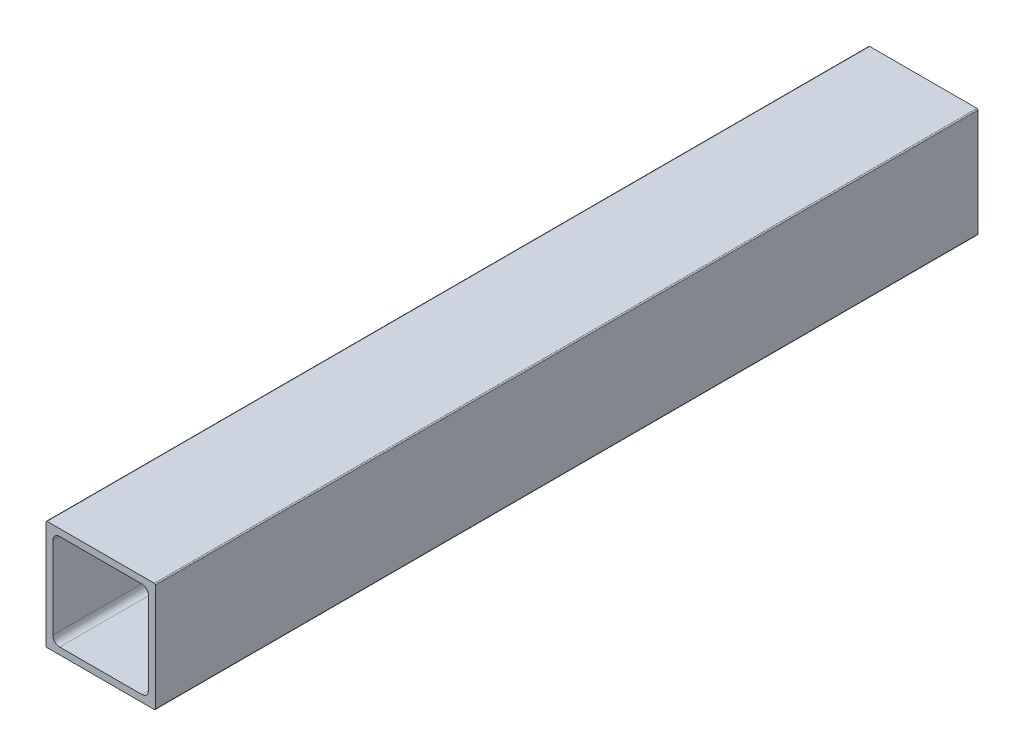
ISO-10303-21;
HEADER;
FILE_DESCRIPTION(('STEP AP214'),'2;1');
FILE_NAME('part.step','',(''),(''),'','','');
FILE_SCHEMA(('AUTOMOTIVE_DESIGN { 1 0 10303 214 1 1 1 1 }'));
ENDSEC;
DATA;
#1=APPLICATION_CONTEXT('core data for automotive mechanical design processes');
#2=APPLICATION_PROTOCOL_DEFINITION('international standard','automotive_design',2000,#1);
#3=PRODUCT_CONTEXT('',#1,'mechanical');
#4=PRODUCT('Part','Part','',(#3));
#5=PRODUCT_RELATED_PRODUCT_CATEGORY('part','',(#4));
#6=PRODUCT_DEFINITION_FORMATION('','',#4);
#7=PRODUCT_DEFINITION_CONTEXT('part definition',#1,'design');
#8=PRODUCT_DEFINITION('design','',#6,#7);
#9=PRODUCT_DEFINITION_SHAPE('','',#8);
#10=(LENGTH_UNIT() NAMED_UNIT(*) SI_UNIT(.MILLI.,.METRE.));
#11=(NAMED_UNIT(*) PLANE_ANGLE_UNIT() SI_UNIT($,.RADIAN.));
#12=(NAMED_UNIT(*) SI_UNIT($,.STERADIAN.) SOLID_ANGLE_UNIT());
#13=UNCERTAINTY_MEASURE_WITH_UNIT(LENGTH_MEASURE(1.E-05),#10,'distance_accuracy_value','');
#14=(GEOMETRIC_REPRESENTATION_CONTEXT(3) GLOBAL_UNCERTAINTY_ASSIGNED_CONTEXT((#13)) GLOBAL_UNIT_ASSIGNED_CONTEXT((#10,
#11,#12)) REPRESENTATION_CONTEXT('',''));
#15=CARTESIAN_POINT('',(0.,0.,0.));
#16=DIRECTION('',(0.,0.,1.));
#17=DIRECTION('',(1.,0.,0.));
#18=AXIS2_PLACEMENT_3D('',#15,#16,#17);
#19=CARTESIAN_POINT('',(1.5875,3.175,1828.8));
#20=DIRECTION('',(1.,0.,0.));
#21=DIRECTION('',(0.,1.,0.));
#22=AXIS2_PLACEMENT_3D('',#19,#20,#21);
#23=PLANE('',#22);
#24=DIRECTION('',(0.,0.,-1.));
#25=VECTOR('',#24,1.);
#26=CARTESIAN_POINT('',(1.5875,22.225,1828.8));
#27=LINE('',#26,#25);
#28=CARTESIAN_POINT('',(1.5875,22.225,191.008));
#29=VERTEX_POINT('',#28);
#30=CARTESIAN_POINT('',(1.5875,22.225,0.));
#31=VERTEX_POINT('',#30);
#32=EDGE_CURVE('E48',#29,#31,#27,.T.);
#33=ORIENTED_EDGE('',*,*,#32,.F.);
#34=DIRECTION('',(0.,-1.,0.));
#35=VECTOR('',#34,1.);
#36=CARTESIAN_POINT('',(1.5875,3.175,191.008));
#37=LINE('',#36,#35);
#38=CARTESIAN_POINT('',(1.5875,3.175,191.008));
#39=VERTEX_POINT('',#38);
#40=EDGE_CURVE('E262',#29,#39,#37,.T.);
#41=ORIENTED_EDGE('',*,*,#40,.T.);
#42=DIRECTION('',(0.,0.,-1.));
#43=VECTOR('',#42,1.);
#44=CARTESIAN_POINT('',(1.5875,3.175,1828.8));
#45=LINE('',#44,#43);
#46=CARTESIAN_POINT('',(1.5875,3.175,0.));
#47=VERTEX_POINT('',#46);
#48=EDGE_CURVE('E264',#39,#47,#45,.T.);
#49=ORIENTED_EDGE('',*,*,#48,.T.);
#50=DIRECTION('',(0.,-1.,0.));
#51=VECTOR('',#50,1.);
#52=CARTESIAN_POINT('',(1.5875,3.175,0.));
#53=LINE('',#52,#51);
#54=EDGE_CURVE('E216',#31,#47,#53,.T.);
#55=ORIENTED_EDGE('',*,*,#54,.F.);
#56=EDGE_LOOP('',(#33,#41,#49,#55));
#57=FACE_BOUND('',#56,.T.);
#58=ADVANCED_FACE('F40',(#57),#23,.T.);
#59=CARTESIAN_POINT('',(3.175,22.225,1828.8));
#60=DIRECTION('',(0.,0.,-1.));
#61=DIRECTION('',(-1.,0.,0.));
#62=AXIS2_PLACEMENT_3D('',#59,#60,#61);
#63=CYLINDRICAL_SURFACE('',#62,1.5875);
#64=CARTESIAN_POINT('',(3.175,22.225,191.008));
#65=DIRECTION('',(0.,0.,1.));
#66=DIRECTION('',(1.,0.,0.));
#67=AXIS2_PLACEMENT_3D('',#64,#65,#66);
#68=CIRCLE('',#67,1.5875);
#69=CARTESIAN_POINT('',(3.175,23.8125,191.008));
#70=VERTEX_POINT('',#69);
#71=EDGE_CURVE('E259',#29,#70,#68,.F.);
#72=ORIENTED_EDGE('',*,*,#71,.F.);
#73=ORIENTED_EDGE('',*,*,#32,.T.);
#74=CARTESIAN_POINT('',(3.175,22.225,0.));
#75=DIRECTION('',(0.,0.,1.));
#76=DIRECTION('',(-1.,0.,0.));
#77=AXIS2_PLACEMENT_3D('',#74,#75,#76);
#78=CIRCLE('',#77,1.5875);
#79=CARTESIAN_POINT('',(3.175,23.8125,0.));
#80=VERTEX_POINT('',#79);
#81=EDGE_CURVE('E186',#80,#31,#78,.T.);
#82=ORIENTED_EDGE('',*,*,#81,.F.);
#83=DIRECTION('',(0.,0.,-1.));
#84=VECTOR('',#83,1.);
#85=CARTESIAN_POINT('',(3.175,23.8125,1828.8));
#86=LINE('',#85,#84);
#87=EDGE_CURVE('E222',#70,#80,#86,.T.);
#88=ORIENTED_EDGE('',*,*,#87,.F.);
#89=EDGE_LOOP('',(#72,#73,#82,#88));
#90=FACE_BOUND('',#89,.T.);
#91=ADVANCED_FACE('F257',(#90),#63,.F.);
#92=CARTESIAN_POINT('',(3.175,23.8125,1828.8));
#93=DIRECTION('',(0.,-1.,0.));
#94=DIRECTION('',(0.,0.,-1.));
#95=AXIS2_PLACEMENT_3D('',#92,#93,#94);
#96=PLANE('',#95);
#97=DIRECTION('',(0.,0.,-1.));
#98=VECTOR('',#97,1.);
#99=CARTESIAN_POINT('',(22.225,23.8125,1828.8));
#100=LINE('',#99,#98);
#101=CARTESIAN_POINT('',(22.225,23.8125,191.008));
#102=VERTEX_POINT('',#101);
#103=CARTESIAN_POINT('',(22.225,23.8125,0.));
#104=VERTEX_POINT('',#103);
#105=EDGE_CURVE('E224',#102,#104,#100,.T.);
#106=ORIENTED_EDGE('',*,*,#105,.F.);
#107=DIRECTION('',(-1.,0.,0.));
#108=VECTOR('',#107,1.);
#109=CARTESIAN_POINT('',(3.175,23.8125,191.008));
#110=LINE('',#109,#108);
#111=EDGE_CURVE('E254',#102,#70,#110,.T.);
#112=ORIENTED_EDGE('',*,*,#111,.T.);
#113=ORIENTED_EDGE('',*,*,#87,.T.);
#114=DIRECTION('',(-1.,0.,0.));
#115=VECTOR('',#114,1.);
#116=CARTESIAN_POINT('',(3.175,23.8125,0.));
#117=LINE('',#116,#115);
#118=EDGE_CURVE('E191',#104,#80,#117,.T.);
#119=ORIENTED_EDGE('',*,*,#118,.F.);
#120=EDGE_LOOP('',(#106,#112,#113,#119));
#121=FACE_BOUND('',#120,.T.);
#122=ADVANCED_FACE('F251',(#121),#96,.T.);
#123=CARTESIAN_POINT('',(22.225,22.225,1828.8));
#124=DIRECTION('',(0.,0.,-1.));
#125=DIRECTION('',(-1.,0.,0.));
#126=AXIS2_PLACEMENT_3D('',#123,#124,#125);
#127=CYLINDRICAL_SURFACE('',#126,1.5875);
#128=CARTESIAN_POINT('',(22.225,22.225,191.008));
#129=DIRECTION('',(0.,0.,1.));
#130=DIRECTION('',(1.,0.,0.));
#131=AXIS2_PLACEMENT_3D('',#128,#129,#130);
#132=CIRCLE('',#131,1.5875);
#133=CARTESIAN_POINT('',(23.8125,22.225,191.008));
#134=VERTEX_POINT('',#133);
#135=EDGE_CURVE('E312',#102,#134,#132,.F.);
#136=ORIENTED_EDGE('',*,*,#135,.F.);
#137=ORIENTED_EDGE('',*,*,#105,.T.);
#138=CARTESIAN_POINT('',(22.225,22.225,0.));
#139=DIRECTION('',(0.,0.,1.));
#140=DIRECTION('',(-1.,0.,0.));
#141=AXIS2_PLACEMENT_3D('',#138,#139,#140);
#142=CIRCLE('',#141,1.5875);
#143=CARTESIAN_POINT('',(23.8125,22.225,0.));
#144=VERTEX_POINT('',#143);
#145=EDGE_CURVE('E232',#144,#104,#142,.T.);
#146=ORIENTED_EDGE('',*,*,#145,.F.);
#147=DIRECTION('',(0.,0.,-1.));
#148=VECTOR('',#147,1.);
#149=CARTESIAN_POINT('',(23.8125,22.225,1828.8));
#150=LINE('',#149,#148);
#151=EDGE_CURVE('E220',#134,#144,#150,.T.);
#152=ORIENTED_EDGE('',*,*,#151,.F.);
#153=EDGE_LOOP('',(#136,#137,#146,#152));
#154=FACE_BOUND('',#153,.T.);
#155=ADVANCED_FACE('F369',(#154),#127,.F.);
#156=CARTESIAN_POINT('',(23.8125,3.175,1828.8));
#157=DIRECTION('',(-1.,0.,0.));
#158=DIRECTION('',(0.,0.,1.));
#159=AXIS2_PLACEMENT_3D('',#156,#157,#158);
#160=PLANE('',#159);
#161=DIRECTION('',(0.,0.,-1.));
#162=VECTOR('',#161,1.);
#163=CARTESIAN_POINT('',(23.8125,3.175,1828.8));
#164=LINE('',#163,#162);
#165=CARTESIAN_POINT('',(23.8125,3.175,191.008));
#166=VERTEX_POINT('',#165);
#167=CARTESIAN_POINT('',(23.8125,3.175,0.));
#168=VERTEX_POINT('',#167);
#169=EDGE_CURVE('E218',#166,#168,#164,.T.);
#170=ORIENTED_EDGE('',*,*,#169,.F.);
#171=DIRECTION('',(0.,1.,0.));
#172=VECTOR('',#171,1.);
#173=CARTESIAN_POINT('',(23.8125,3.175,191.008));
#174=LINE('',#173,#172);
#175=EDGE_CURVE('E314',#166,#134,#174,.T.);
#176=ORIENTED_EDGE('',*,*,#175,.T.);
#177=ORIENTED_EDGE('',*,*,#151,.T.);
#178=DIRECTION('',(0.,1.,0.));
#179=VECTOR('',#178,1.);
#180=CARTESIAN_POINT('',(23.8125,3.175,0.));
#181=LINE('',#180,#179);
#182=EDGE_CURVE('E195',#168,#144,#181,.T.);
#183=ORIENTED_EDGE('',*,*,#182,.F.);
#184=EDGE_LOOP('',(#170,#176,#177,#183));
#185=FACE_BOUND('',#184,.T.);
#186=ADVANCED_FACE('F373',(#185),#160,.T.);
#187=CARTESIAN_POINT('',(22.225,3.175,1828.8));
#188=DIRECTION('',(0.,0.,-1.));
#189=DIRECTION('',(-1.,0.,0.));
#190=AXIS2_PLACEMENT_3D('',#187,#188,#189);
#191=CYLINDRICAL_SURFACE('',#190,1.5875);
#192=CARTESIAN_POINT('',(22.225,3.175,191.008));
#193=DIRECTION('',(0.,0.,1.));
#194=DIRECTION('',(1.,0.,0.));
#195=AXIS2_PLACEMENT_3D('',#192,#193,#194);
#196=CIRCLE('',#195,1.5875);
#197=CARTESIAN_POINT('',(22.225,1.5875,191.008));
#198=VERTEX_POINT('',#197);
#199=EDGE_CURVE('E317',#166,#198,#196,.F.);
#200=ORIENTED_EDGE('',*,*,#199,.F.);
#201=ORIENTED_EDGE('',*,*,#169,.T.);
#202=CARTESIAN_POINT('',(22.225,3.175,0.));
#203=DIRECTION('',(0.,0.,1.));
#204=DIRECTION('',(-1.,0.,0.));
#205=AXIS2_PLACEMENT_3D('',#202,#203,#204);
#206=CIRCLE('',#205,1.5875);
#207=CARTESIAN_POINT('',(22.225,1.5875,0.));
#208=VERTEX_POINT('',#207);
#209=EDGE_CURVE('E294',#208,#168,#206,.T.);
#210=ORIENTED_EDGE('',*,*,#209,.F.);
#211=DIRECTION('',(0.,0.,-1.));
#212=VECTOR('',#211,1.);
#213=CARTESIAN_POINT('',(22.225,1.5875,1828.8));
#214=LINE('',#213,#212);
#215=EDGE_CURVE('E221',#198,#208,#214,.T.);
#216=ORIENTED_EDGE('',*,*,#215,.F.);
#217=EDGE_LOOP('',(#200,#201,#210,#216));
#218=FACE_BOUND('',#217,.T.);
#219=ADVANCED_FACE('F370',(#218),#191,.F.);
#220=CARTESIAN_POINT('',(3.175,1.5875,1828.8));
#221=DIRECTION('',(0.,1.,0.));
#222=DIRECTION('',(1.,0.,0.));
#223=AXIS2_PLACEMENT_3D('',#220,#221,#222);
#224=PLANE('',#223);
#225=DIRECTION('',(0.,0.,-1.));
#226=VECTOR('',#225,1.);
#227=CARTESIAN_POINT('',(3.175,1.5875,1828.8));
#228=LINE('',#227,#226);
#229=CARTESIAN_POINT('',(3.175,1.5875,191.008));
#230=VERTEX_POINT('',#229);
#231=CARTESIAN_POINT('',(3.175,1.5875,0.));
#232=VERTEX_POINT('',#231);
#233=EDGE_CURVE('E277',#230,#232,#228,.T.);
#234=ORIENTED_EDGE('',*,*,#233,.F.);
#235=DIRECTION('',(1.,0.,0.));
#236=VECTOR('',#235,1.);
#237=CARTESIAN_POINT('',(3.175,1.5875,191.008));
#238=LINE('',#237,#236);
#239=EDGE_CURVE('E55',#230,#198,#238,.T.);
#240=ORIENTED_EDGE('',*,*,#239,.T.);
#241=ORIENTED_EDGE('',*,*,#215,.T.);
#242=DIRECTION('',(1.,0.,0.));
#243=VECTOR('',#242,1.);
#244=CARTESIAN_POINT('',(3.175,1.5875,0.));
#245=LINE('',#244,#243);
#246=EDGE_CURVE('E215',#232,#208,#245,.T.);
#247=ORIENTED_EDGE('',*,*,#246,.F.);
#248=EDGE_LOOP('',(#234,#240,#241,#247));
#249=FACE_BOUND('',#248,.T.);
#250=ADVANCED_FACE('F372',(#249),#224,.T.);
#251=CARTESIAN_POINT('',(3.175,3.175,1828.8));
#252=DIRECTION('',(0.,0.,-1.));
#253=DIRECTION('',(-1.,0.,0.));
#254=AXIS2_PLACEMENT_3D('',#251,#252,#253);
#255=CYLINDRICAL_SURFACE('',#254,1.5875);
#256=CARTESIAN_POINT('',(3.175,3.175,191.008));
#257=DIRECTION('',(0.,0.,1.));
#258=DIRECTION('',(1.,0.,0.));
#259=AXIS2_PLACEMENT_3D('',#256,#257,#258);
#260=CIRCLE('',#259,1.5875);
#261=EDGE_CURVE('E320',#230,#39,#260,.F.);
#262=ORIENTED_EDGE('',*,*,#261,.F.);
#263=ORIENTED_EDGE('',*,*,#233,.T.);
#264=CARTESIAN_POINT('',(3.175,3.175,0.));
#265=DIRECTION('',(0.,0.,1.));
#266=DIRECTION('',(1.,0.,0.));
#267=AXIS2_PLACEMENT_3D('',#264,#265,#266);
#268=CIRCLE('',#267,1.5875);
#269=EDGE_CURVE('E211',#47,#232,#268,.T.);
#270=ORIENTED_EDGE('',*,*,#269,.F.);
#271=ORIENTED_EDGE('',*,*,#48,.F.);
#272=EDGE_LOOP('',(#262,#263,#270,#271));
#273=FACE_BOUND('',#272,.T.);
#274=ADVANCED_FACE('F391',(#273),#255,.F.);
#275=CARTESIAN_POINT('',(0.,0.254,1828.8));
#276=DIRECTION('',(1.,0.,0.));
#277=DIRECTION('',(0.,1.,0.));
#278=AXIS2_PLACEMENT_3D('',#275,#276,#277);
#279=PLANE('',#278);
#280=DIRECTION('',(0.,-1.,0.));
#281=VECTOR('',#280,1.);
#282=CARTESIAN_POINT('',(0.,0.254,191.008));
#283=LINE('',#282,#281);
#284=CARTESIAN_POINT('',(0.,25.146,191.008));
#285=VERTEX_POINT('',#284);
#286=CARTESIAN_POINT('',(0.,0.254,191.008));
#287=VERTEX_POINT('',#286);
#288=EDGE_CURVE('E63',#285,#287,#283,.T.);
#289=ORIENTED_EDGE('',*,*,#288,.F.);
#290=DIRECTION('',(0.,0.,-1.));
#291=VECTOR('',#290,1.);
#292=CARTESIAN_POINT('',(0.,25.146,1828.8));
#293=LINE('',#292,#291);
#294=CARTESIAN_POINT('',(0.,25.146,0.));
#295=VERTEX_POINT('',#294);
#296=EDGE_CURVE('E209',#285,#295,#293,.T.);
#297=ORIENTED_EDGE('',*,*,#296,.T.);
#298=DIRECTION('',(0.,-1.,0.));
#299=VECTOR('',#298,1.);
#300=CARTESIAN_POINT('',(0.,0.254,0.));
#301=LINE('',#300,#299);
#302=CARTESIAN_POINT('',(0.,0.254,0.));
#303=VERTEX_POINT('',#302);
#304=EDGE_CURVE('E275',#295,#303,#301,.T.);
#305=ORIENTED_EDGE('',*,*,#304,.T.);
#306=DIRECTION('',(0.,0.,-1.));
#307=VECTOR('',#306,1.);
#308=CARTESIAN_POINT('',(0.,0.254,1828.8));
#309=LINE('',#308,#307);
#310=EDGE_CURVE('E185',#287,#303,#309,.T.);
#311=ORIENTED_EDGE('',*,*,#310,.F.);
#312=EDGE_LOOP('',(#289,#297,#305,#311));
#313=FACE_BOUND('',#312,.T.);
#314=ADVANCED_FACE('F348',(#313),#279,.F.);
#315=CARTESIAN_POINT('',(0.254,25.146,1828.8));
#316=DIRECTION('',(0.,0.,-1.));
#317=DIRECTION('',(-1.,0.,0.));
#318=AXIS2_PLACEMENT_3D('',#315,#316,#317);
#319=CYLINDRICAL_SURFACE('',#318,0.254);
#320=ORIENTED_EDGE('',*,*,#296,.F.);
#321=CARTESIAN_POINT('',(0.254,25.146,191.008));
#322=DIRECTION('',(0.,0.,1.));
#323=DIRECTION('',(1.,0.,0.));
#324=AXIS2_PLACEMENT_3D('',#321,#322,#323);
#325=CIRCLE('',#324,0.254);
#326=CARTESIAN_POINT('',(0.254,25.4,191.008));
#327=VERTEX_POINT('',#326);
#328=EDGE_CURVE('E323',#285,#327,#325,.F.);
#329=ORIENTED_EDGE('',*,*,#328,.T.);
#330=DIRECTION('',(0.,0.,-1.));
#331=VECTOR('',#330,1.);
#332=CARTESIAN_POINT('',(0.254,25.4,1828.8));
#333=LINE('',#332,#331);
#334=CARTESIAN_POINT('',(0.254,25.4,0.));
#335=VERTEX_POINT('',#334);
#336=EDGE_CURVE('E207',#327,#335,#333,.T.);
#337=ORIENTED_EDGE('',*,*,#336,.T.);
#338=CARTESIAN_POINT('',(0.254,25.146,0.));
#339=DIRECTION('',(0.,0.,1.));
#340=DIRECTION('',(-1.,0.,0.));
#341=AXIS2_PLACEMENT_3D('',#338,#339,#340);
#342=CIRCLE('',#341,0.254);
#343=EDGE_CURVE('E206',#335,#295,#342,.T.);
#344=ORIENTED_EDGE('',*,*,#343,.T.);
#345=EDGE_LOOP('',(#320,#329,#337,#344));
#346=FACE_BOUND('',#345,.T.);
#347=ADVANCED_FACE('F345',(#346),#319,.T.);
#348=CARTESIAN_POINT('',(0.254,25.4,1828.8));
#349=DIRECTION('',(0.,-1.,0.));
#350=DIRECTION('',(0.,0.,-1.));
#351=AXIS2_PLACEMENT_3D('',#348,#349,#350);
#352=PLANE('',#351);
#353=DIRECTION('',(-1.,0.,0.));
#354=VECTOR('',#353,1.);
#355=CARTESIAN_POINT('',(0.254,25.4,191.008));
#356=LINE('',#355,#354);
#357=CARTESIAN_POINT('',(25.146,25.4,191.008));
#358=VERTEX_POINT('',#357);
#359=EDGE_CURVE('E326',#358,#327,#356,.T.);
#360=ORIENTED_EDGE('',*,*,#359,.F.);
#361=DIRECTION('',(0.,0.,-1.));
#362=VECTOR('',#361,1.);
#363=CARTESIAN_POINT('',(25.146,25.4,1828.8));
#364=LINE('',#363,#362);
#365=CARTESIAN_POINT('',(25.146,25.4,0.));
#366=VERTEX_POINT('',#365);
#367=EDGE_CURVE('E210',#358,#366,#364,.T.);
#368=ORIENTED_EDGE('',*,*,#367,.T.);
#369=DIRECTION('',(-1.,0.,0.));
#370=VECTOR('',#369,1.);
#371=CARTESIAN_POINT('',(0.254,25.4,0.));
#372=LINE('',#371,#370);
#373=EDGE_CURVE('E201',#366,#335,#372,.T.);
#374=ORIENTED_EDGE('',*,*,#373,.T.);
#375=ORIENTED_EDGE('',*,*,#336,.F.);
#376=EDGE_LOOP('',(#360,#368,#374,#375));
#377=FACE_BOUND('',#376,.T.);
#378=ADVANCED_FACE('F42',(#377),#352,.F.);
#379=CARTESIAN_POINT('',(25.146,25.146,1828.8));
#380=DIRECTION('',(0.,0.,-1.));
#381=DIRECTION('',(-1.,0.,0.));
#382=AXIS2_PLACEMENT_3D('',#379,#380,#381);
#383=CYLINDRICAL_SURFACE('',#382,0.254);
#384=ORIENTED_EDGE('',*,*,#367,.F.);
#385=CARTESIAN_POINT('',(25.146,25.146,191.008));
#386=DIRECTION('',(0.,0.,1.));
#387=DIRECTION('',(1.,0.,0.));
#388=AXIS2_PLACEMENT_3D('',#385,#386,#387);
#389=CIRCLE('',#388,0.254);
#390=CARTESIAN_POINT('',(25.4,25.146,191.008));
#391=VERTEX_POINT('',#390);
#392=EDGE_CURVE('E328',#358,#391,#389,.F.);
#393=ORIENTED_EDGE('',*,*,#392,.T.);
#394=DIRECTION('',(0.,0.,-1.));
#395=VECTOR('',#394,1.);
#396=CARTESIAN_POINT('',(25.4,25.146,1828.8));
#397=LINE('',#396,#395);
#398=CARTESIAN_POINT('',(25.4,25.146,0.));
#399=VERTEX_POINT('',#398);
#400=EDGE_CURVE('E200',#391,#399,#397,.T.);
#401=ORIENTED_EDGE('',*,*,#400,.T.);
#402=CARTESIAN_POINT('',(25.146,25.146,0.));
#403=DIRECTION('',(0.,0.,1.));
#404=DIRECTION('',(-1.,0.,0.));
#405=AXIS2_PLACEMENT_3D('',#402,#403,#404);
#406=CIRCLE('',#405,0.254);
#407=EDGE_CURVE('E205',#399,#366,#406,.T.);
#408=ORIENTED_EDGE('',*,*,#407,.T.);
#409=EDGE_LOOP('',(#384,#393,#401,#408));
#410=FACE_BOUND('',#409,.T.);
#411=ADVANCED_FACE('F338',(#410),#383,.T.);
#412=CARTESIAN_POINT('',(25.4,0.254,1828.8));
#413=DIRECTION('',(-1.,0.,0.));
#414=DIRECTION('',(0.,0.,1.));
#415=AXIS2_PLACEMENT_3D('',#412,#413,#414);
#416=PLANE('',#415);
#417=DIRECTION('',(0.,1.,0.));
#418=VECTOR('',#417,1.);
#419=CARTESIAN_POINT('',(25.4,0.254,191.008));
#420=LINE('',#419,#418);
#421=CARTESIAN_POINT('',(25.4,0.254,191.008));
#422=VERTEX_POINT('',#421);
#423=EDGE_CURVE('E331',#422,#391,#420,.T.);
#424=ORIENTED_EDGE('',*,*,#423,.F.);
#425=DIRECTION('',(0.,0.,-1.));
#426=VECTOR('',#425,1.);
#427=CARTESIAN_POINT('',(25.4,0.254,1828.8));
#428=LINE('',#427,#426);
#429=CARTESIAN_POINT('',(25.4,0.254,0.));
#430=VERTEX_POINT('',#429);
#431=EDGE_CURVE('E198',#422,#430,#428,.T.);
#432=ORIENTED_EDGE('',*,*,#431,.T.);
#433=DIRECTION('',(0.,1.,0.));
#434=VECTOR('',#433,1.);
#435=CARTESIAN_POINT('',(25.4,0.254,0.));
#436=LINE('',#435,#434);
#437=EDGE_CURVE('E231',#430,#399,#436,.T.);
#438=ORIENTED_EDGE('',*,*,#437,.T.);
#439=ORIENTED_EDGE('',*,*,#400,.F.);
#440=EDGE_LOOP('',(#424,#432,#438,#439));
#441=FACE_BOUND('',#440,.T.);
#442=ADVANCED_FACE('F337',(#441),#416,.F.);
#443=CARTESIAN_POINT('',(25.146,0.254,1828.8));
#444=DIRECTION('',(0.,0.,-1.));
#445=DIRECTION('',(-1.,0.,0.));
#446=AXIS2_PLACEMENT_3D('',#443,#444,#445);
#447=CYLINDRICAL_SURFACE('',#446,0.254);
#448=ORIENTED_EDGE('',*,*,#431,.F.);
#449=CARTESIAN_POINT('',(25.146,0.254,191.008));
#450=DIRECTION('',(0.,0.,1.));
#451=DIRECTION('',(1.,0.,0.));
#452=AXIS2_PLACEMENT_3D('',#449,#450,#451);
#453=CIRCLE('',#452,0.254);
#454=CARTESIAN_POINT('',(25.146,0.,191.008));
#455=VERTEX_POINT('',#454);
#456=EDGE_CURVE('E179',#422,#455,#453,.F.);
#457=ORIENTED_EDGE('',*,*,#456,.T.);
#458=DIRECTION('',(0.,0.,-1.));
#459=VECTOR('',#458,1.);
#460=CARTESIAN_POINT('',(25.146,0.,1828.8));
#461=LINE('',#460,#459);
#462=CARTESIAN_POINT('',(25.146,0.,0.));
#463=VERTEX_POINT('',#462);
#464=EDGE_CURVE('E178',#455,#463,#461,.T.);
#465=ORIENTED_EDGE('',*,*,#464,.T.);
#466=CARTESIAN_POINT('',(25.146,0.254,0.));
#467=DIRECTION('',(0.,0.,1.));
#468=DIRECTION('',(1.,0.,0.));
#469=AXIS2_PLACEMENT_3D('',#466,#467,#468);
#470=CIRCLE('',#469,0.254);
#471=EDGE_CURVE('E226',#463,#430,#470,.T.);
#472=ORIENTED_EDGE('',*,*,#471,.T.);
#473=EDGE_LOOP('',(#448,#457,#465,#472));
#474=FACE_BOUND('',#473,.T.);
#475=ADVANCED_FACE('F335',(#474),#447,.T.);
#476=CARTESIAN_POINT('',(0.254,0.,1828.8));
#477=DIRECTION('',(0.,1.,0.));
#478=DIRECTION('',(1.,0.,0.));
#479=AXIS2_PLACEMENT_3D('',#476,#477,#478);
#480=PLANE('',#479);
#481=DIRECTION('',(1.,0.,0.));
#482=VECTOR('',#481,1.);
#483=CARTESIAN_POINT('',(0.254,0.,191.008));
#484=LINE('',#483,#482);
#485=CARTESIAN_POINT('',(0.254,0.,191.008));
#486=VERTEX_POINT('',#485);
#487=EDGE_CURVE('E167',#486,#455,#484,.T.);
#488=ORIENTED_EDGE('',*,*,#487,.F.);
#489=DIRECTION('',(0.,0.,-1.));
#490=VECTOR('',#489,1.);
#491=CARTESIAN_POINT('',(0.254,0.,1828.8));
#492=LINE('',#491,#490);
#493=CARTESIAN_POINT('',(0.254,0.,0.));
#494=VERTEX_POINT('',#493);
#495=EDGE_CURVE('E176',#486,#494,#492,.T.);
#496=ORIENTED_EDGE('',*,*,#495,.T.);
#497=DIRECTION('',(1.,0.,0.));
#498=VECTOR('',#497,1.);
#499=CARTESIAN_POINT('',(0.254,0.,0.));
#500=LINE('',#499,#498);
#501=EDGE_CURVE('E230',#494,#463,#500,.T.);
#502=ORIENTED_EDGE('',*,*,#501,.T.);
#503=ORIENTED_EDGE('',*,*,#464,.F.);
#504=EDGE_LOOP('',(#488,#496,#502,#503));
#505=FACE_BOUND('',#504,.T.);
#506=ADVANCED_FACE('F174',(#505),#480,.F.);
#507=CARTESIAN_POINT('',(0.254,0.254,1828.8));
#508=DIRECTION('',(0.,0.,-1.));
#509=DIRECTION('',(-1.,0.,0.));
#510=AXIS2_PLACEMENT_3D('',#507,#508,#509);
#511=CYLINDRICAL_SURFACE('',#510,0.254);
#512=ORIENTED_EDGE('',*,*,#495,.F.);
#513=CARTESIAN_POINT('',(0.254,0.254,191.008));
#514=DIRECTION('',(0.,0.,1.));
#515=DIRECTION('',(1.,0.,0.));
#516=AXIS2_PLACEMENT_3D('',#513,#514,#515);
#517=CIRCLE('',#516,0.254);
#518=EDGE_CURVE('E11',#486,#287,#517,.F.);
#519=ORIENTED_EDGE('',*,*,#518,.T.);
#520=ORIENTED_EDGE('',*,*,#310,.T.);
#521=CARTESIAN_POINT('',(0.254,0.254,0.));
#522=DIRECTION('',(0.,0.,1.));
#523=DIRECTION('',(-1.,0.,0.));
#524=AXIS2_PLACEMENT_3D('',#521,#522,#523);
#525=CIRCLE('',#524,0.254);
#526=EDGE_CURVE('E184',#303,#494,#525,.T.);
#527=ORIENTED_EDGE('',*,*,#526,.T.);
#528=EDGE_LOOP('',(#512,#519,#520,#527));
#529=FACE_BOUND('',#528,.T.);
#530=ADVANCED_FACE('F182',(#529),#511,.T.);
#531=CARTESIAN_POINT('',(0.254,0.254,0.));
#532=DIRECTION('',(0.,0.,-1.));
#533=DIRECTION('',(0.,-1.,0.));
#534=AXIS2_PLACEMENT_3D('',#531,#532,#533);
#535=PLANE('',#534);
#536=ORIENTED_EDGE('',*,*,#54,.T.);
#537=ORIENTED_EDGE('',*,*,#269,.T.);
#538=ORIENTED_EDGE('',*,*,#246,.T.);
#539=ORIENTED_EDGE('',*,*,#209,.T.);
#540=ORIENTED_EDGE('',*,*,#182,.T.);
#541=ORIENTED_EDGE('',*,*,#145,.T.);
#542=ORIENTED_EDGE('',*,*,#118,.T.);
#543=ORIENTED_EDGE('',*,*,#81,.T.);
#544=EDGE_LOOP('',(#536,#537,#538,#539,#540,#541,#542,#543));
#545=FACE_BOUND('',#544,.T.);
#546=ORIENTED_EDGE('',*,*,#526,.F.);
#547=ORIENTED_EDGE('',*,*,#304,.F.);
#548=ORIENTED_EDGE('',*,*,#343,.F.);
#549=ORIENTED_EDGE('',*,*,#373,.F.);
#550=ORIENTED_EDGE('',*,*,#407,.F.);
#551=ORIENTED_EDGE('',*,*,#437,.F.);
#552=ORIENTED_EDGE('',*,*,#471,.F.);
#553=ORIENTED_EDGE('',*,*,#501,.F.);
#554=EDGE_LOOP('',(#546,#547,#548,#549,#550,#551,#552,#553));
#555=FACE_BOUND('',#554,.T.);
#556=ADVANCED_FACE('F243',(#545,#555),#535,.T.);
#557=CARTESIAN_POINT('',(0.,0.,191.008));
#558=DIRECTION('',(0.,0.,1.));
#559=DIRECTION('',(1.,0.,0.));
#560=AXIS2_PLACEMENT_3D('',#557,#558,#559);
#561=PLANE('',#560);
#562=ORIENTED_EDGE('',*,*,#71,.T.);
#563=ORIENTED_EDGE('',*,*,#111,.F.);
#564=ORIENTED_EDGE('',*,*,#135,.T.);
#565=ORIENTED_EDGE('',*,*,#175,.F.);
#566=ORIENTED_EDGE('',*,*,#199,.T.);
#567=ORIENTED_EDGE('',*,*,#239,.F.);
#568=ORIENTED_EDGE('',*,*,#261,.T.);
#569=ORIENTED_EDGE('',*,*,#40,.F.);
#570=EDGE_LOOP('',(#562,#563,#564,#565,#566,#567,#568,#569));
#571=FACE_BOUND('',#570,.T.);
#572=ORIENTED_EDGE('',*,*,#288,.T.);
#573=ORIENTED_EDGE('',*,*,#518,.F.);
#574=ORIENTED_EDGE('',*,*,#487,.T.);
#575=ORIENTED_EDGE('',*,*,#456,.F.);
#576=ORIENTED_EDGE('',*,*,#423,.T.);
#577=ORIENTED_EDGE('',*,*,#392,.F.);
#578=ORIENTED_EDGE('',*,*,#359,.T.);
#579=ORIENTED_EDGE('',*,*,#328,.F.);
#580=EDGE_LOOP('',(#572,#573,#574,#575,#576,#577,#578,#579));
#581=FACE_BOUND('',#580,.T.);
#582=ADVANCED_FACE('F166',(#571,#581),#561,.T.);
#583=CLOSED_SHELL('',(#58,#91,#122,#155,#186,#219,#250,#274,#314,#347,#378,#411,#442,#475,#506,
#530,#556,#582));
#584=MANIFOLD_SOLID_BREP('B2',#583);
#585=ADVANCED_BREP_SHAPE_REPRESENTATION('',(#18,#584),#14);
#586=SHAPE_DEFINITION_REPRESENTATION(#9,#585);
ENDSEC;
END-ISO-10303-21;
